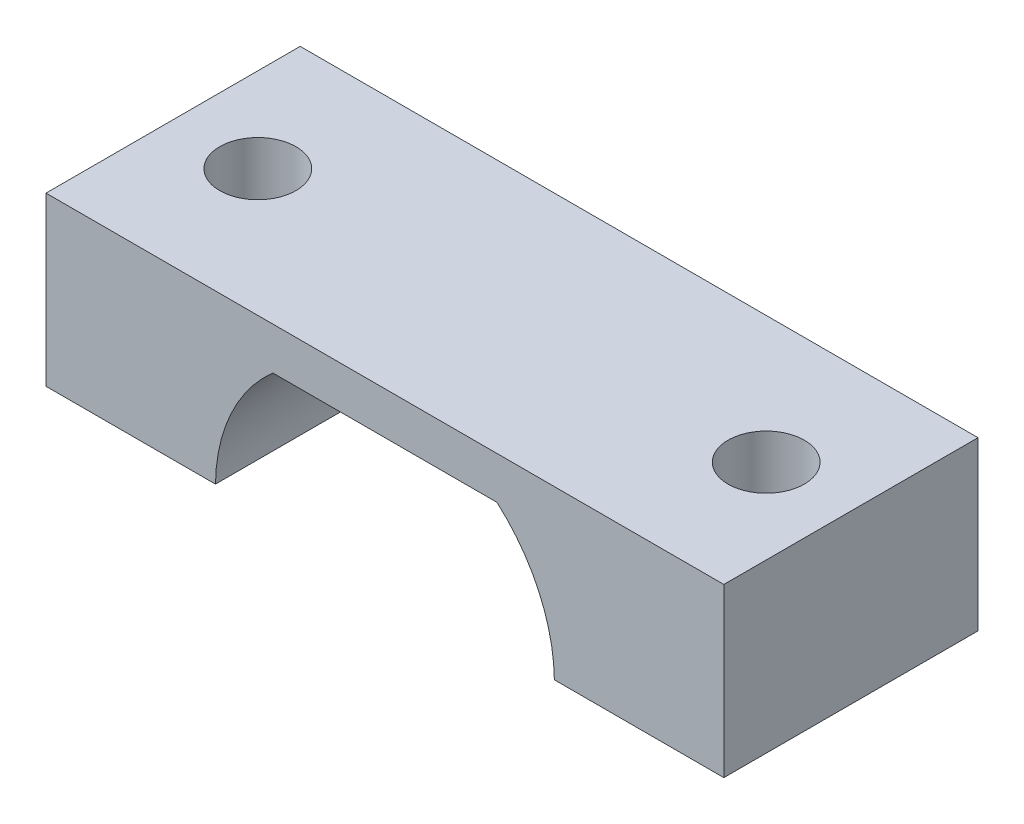
ISO-10303-21;
HEADER;
FILE_DESCRIPTION(('STEP AP214'),'2;1');
FILE_NAME('part.step','',(''),(''),'','','');
FILE_SCHEMA(('AUTOMOTIVE_DESIGN { 1 0 10303 214 1 1 1 1 }'));
ENDSEC;
DATA;
#1=APPLICATION_CONTEXT('core data for automotive mechanical design processes');
#2=APPLICATION_PROTOCOL_DEFINITION('international standard','automotive_design',2000,#1);
#3=PRODUCT_CONTEXT('',#1,'mechanical');
#4=PRODUCT('Part','Part','',(#3));
#5=PRODUCT_RELATED_PRODUCT_CATEGORY('part','',(#4));
#6=PRODUCT_DEFINITION_FORMATION('','',#4);
#7=PRODUCT_DEFINITION_CONTEXT('part definition',#1,'design');
#8=PRODUCT_DEFINITION('design','',#6,#7);
#9=PRODUCT_DEFINITION_SHAPE('','',#8);
#10=(LENGTH_UNIT() NAMED_UNIT(*) SI_UNIT(.MILLI.,.METRE.));
#11=(NAMED_UNIT(*) PLANE_ANGLE_UNIT() SI_UNIT($,.RADIAN.));
#12=(NAMED_UNIT(*) SI_UNIT($,.STERADIAN.) SOLID_ANGLE_UNIT());
#13=UNCERTAINTY_MEASURE_WITH_UNIT(LENGTH_MEASURE(1.E-05),#10,'distance_accuracy_value','');
#14=(GEOMETRIC_REPRESENTATION_CONTEXT(3) GLOBAL_UNCERTAINTY_ASSIGNED_CONTEXT((#13)) GLOBAL_UNIT_ASSIGNED_CONTEXT((#10,
#11,#12)) REPRESENTATION_CONTEXT('',''));
#15=CARTESIAN_POINT('',(0.,0.,0.));
#16=DIRECTION('',(0.,0.,1.));
#17=DIRECTION('',(1.,0.,0.));
#18=AXIS2_PLACEMENT_3D('',#15,#16,#17);
#19=CARTESIAN_POINT('',(0.,0.,7.5));
#20=DIRECTION('',(0.,0.,-1.));
#21=DIRECTION('',(-1.,0.,0.));
#22=AXIS2_PLACEMENT_3D('',#19,#20,#21);
#23=CYLINDRICAL_SURFACE('',#22,10.);
#24=CARTESIAN_POINT('',(0.,0.,-7.5));
#25=DIRECTION('',(0.,0.,-1.));
#26=DIRECTION('',(1.,0.,0.));
#27=AXIS2_PLACEMENT_3D('',#24,#25,#26);
#28=CIRCLE('',#27,10.);
#29=CARTESIAN_POINT('',(-9.99921871948004,0.125,-7.5));
#30=VERTEX_POINT('',#29);
#31=CARTESIAN_POINT('',(-6.61437827766148,7.5,-7.5));
#32=VERTEX_POINT('',#31);
#33=EDGE_CURVE('E140',#30,#32,#28,.T.);
#34=ORIENTED_EDGE('',*,*,#33,.T.);
#35=DIRECTION('',(0.,0.,-1.));
#36=VECTOR('',#35,1.);
#37=CARTESIAN_POINT('',(-6.61437827766148,7.5,7.5));
#38=LINE('',#37,#36);
#39=CARTESIAN_POINT('',(-6.61437827766148,7.5,7.5));
#40=VERTEX_POINT('',#39);
#41=EDGE_CURVE('E11',#40,#32,#38,.T.);
#42=ORIENTED_EDGE('',*,*,#41,.F.);
#43=CARTESIAN_POINT('',(0.,0.,7.5));
#44=DIRECTION('',(0.,0.,-1.));
#45=DIRECTION('',(1.,0.,0.));
#46=AXIS2_PLACEMENT_3D('',#43,#44,#45);
#47=CIRCLE('',#46,10.);
#48=CARTESIAN_POINT('',(-9.99921871948004,0.125,7.5));
#49=VERTEX_POINT('',#48);
#50=EDGE_CURVE('E163',#49,#40,#47,.T.);
#51=ORIENTED_EDGE('',*,*,#50,.F.);
#52=DIRECTION('',(0.,0.,-1.));
#53=VECTOR('',#52,1.);
#54=CARTESIAN_POINT('',(-9.99921871948004,0.125,7.5));
#55=LINE('',#54,#53);
#56=EDGE_CURVE('E136',#49,#30,#55,.T.);
#57=ORIENTED_EDGE('',*,*,#56,.T.);
#58=EDGE_LOOP('',(#34,#42,#51,#57));
#59=FACE_BOUND('',#58,.T.);
#60=ADVANCED_FACE('F39',(#59),#23,.F.);
#61=CARTESIAN_POINT('',(-6.61437827766148,7.5,7.5));
#62=DIRECTION('',(0.,1.,0.));
#63=DIRECTION('',(0.,0.,1.));
#64=AXIS2_PLACEMENT_3D('',#61,#62,#63);
#65=PLANE('',#64);
#66=DIRECTION('',(1.,0.,0.));
#67=VECTOR('',#66,1.);
#68=CARTESIAN_POINT('',(-6.61437827766148,7.5,-7.5));
#69=LINE('',#68,#67);
#70=CARTESIAN_POINT('',(6.61437827766148,7.5,-7.5));
#71=VERTEX_POINT('',#70);
#72=EDGE_CURVE('E144',#32,#71,#69,.T.);
#73=ORIENTED_EDGE('',*,*,#72,.T.);
#74=DIRECTION('',(0.,0.,-1.));
#75=VECTOR('',#74,1.);
#76=CARTESIAN_POINT('',(6.61437827766148,7.5,7.5));
#77=LINE('',#76,#75);
#78=CARTESIAN_POINT('',(6.61437827766148,7.5,7.5));
#79=VERTEX_POINT('',#78);
#80=EDGE_CURVE('E48',#79,#71,#77,.T.);
#81=ORIENTED_EDGE('',*,*,#80,.F.);
#82=DIRECTION('',(1.,0.,0.));
#83=VECTOR('',#82,1.);
#84=CARTESIAN_POINT('',(-6.61437827766148,7.5,7.5));
#85=LINE('',#84,#83);
#86=EDGE_CURVE('E99',#40,#79,#85,.T.);
#87=ORIENTED_EDGE('',*,*,#86,.F.);
#88=ORIENTED_EDGE('',*,*,#41,.T.);
#89=EDGE_LOOP('',(#73,#81,#87,#88));
#90=FACE_BOUND('',#89,.T.);
#91=ADVANCED_FACE('F245',(#90),#65,.F.);
#92=CARTESIAN_POINT('',(0.,0.,7.5));
#93=DIRECTION('',(0.,0.,-1.));
#94=DIRECTION('',(-1.,0.,0.));
#95=AXIS2_PLACEMENT_3D('',#92,#93,#94);
#96=CYLINDRICAL_SURFACE('',#95,10.);
#97=CARTESIAN_POINT('',(0.,0.,-7.5));
#98=DIRECTION('',(0.,0.,-1.));
#99=DIRECTION('',(1.,0.,0.));
#100=AXIS2_PLACEMENT_3D('',#97,#98,#99);
#101=CIRCLE('',#100,10.);
#102=CARTESIAN_POINT('',(9.99921871948004,0.125,-7.5));
#103=VERTEX_POINT('',#102);
#104=EDGE_CURVE('E148',#71,#103,#101,.T.);
#105=ORIENTED_EDGE('',*,*,#104,.T.);
#106=DIRECTION('',(0.,0.,-1.));
#107=VECTOR('',#106,1.);
#108=CARTESIAN_POINT('',(9.99921871948004,0.125,7.5));
#109=LINE('',#108,#107);
#110=CARTESIAN_POINT('',(9.99921871948004,0.125,7.5));
#111=VERTEX_POINT('',#110);
#112=EDGE_CURVE('E174',#111,#103,#109,.T.);
#113=ORIENTED_EDGE('',*,*,#112,.F.);
#114=CARTESIAN_POINT('',(0.,0.,7.5));
#115=DIRECTION('',(0.,0.,-1.));
#116=DIRECTION('',(1.,0.,0.));
#117=AXIS2_PLACEMENT_3D('',#114,#115,#116);
#118=CIRCLE('',#117,10.);
#119=EDGE_CURVE('E184',#79,#111,#118,.T.);
#120=ORIENTED_EDGE('',*,*,#119,.F.);
#121=ORIENTED_EDGE('',*,*,#80,.T.);
#122=EDGE_LOOP('',(#105,#113,#120,#121));
#123=FACE_BOUND('',#122,.T.);
#124=ADVANCED_FACE('F182',(#123),#96,.F.);
#125=CARTESIAN_POINT('',(9.99921871948004,0.125,7.5));
#126=DIRECTION('',(0.,1.,0.));
#127=DIRECTION('',(0.,0.,1.));
#128=AXIS2_PLACEMENT_3D('',#125,#126,#127);
#129=PLANE('',#128);
#130=CARTESIAN_POINT('',(15.,0.125,0.));
#131=DIRECTION('',(0.,1.,0.));
#132=DIRECTION('',(0.,0.,1.));
#133=AXIS2_PLACEMENT_3D('',#130,#131,#132);
#134=CIRCLE('',#133,2.25);
#135=CARTESIAN_POINT('',(15.,0.125,2.24999999999999));
#136=VERTEX_POINT('',#135);
#137=EDGE_CURVE('E211',#136,#136,#134,.T.);
#138=ORIENTED_EDGE('',*,*,#137,.T.);
#139=EDGE_LOOP('',(#138));
#140=FACE_BOUND('',#139,.T.);
#141=DIRECTION('',(1.,0.,0.));
#142=VECTOR('',#141,1.);
#143=CARTESIAN_POINT('',(9.99921871948004,0.125,-7.5));
#144=LINE('',#143,#142);
#145=CARTESIAN_POINT('',(20.,0.125,-7.5));
#146=VERTEX_POINT('',#145);
#147=EDGE_CURVE('E151',#103,#146,#144,.T.);
#148=ORIENTED_EDGE('',*,*,#147,.T.);
#149=DIRECTION('',(0.,0.,-1.));
#150=VECTOR('',#149,1.);
#151=CARTESIAN_POINT('',(20.,0.125,7.5));
#152=LINE('',#151,#150);
#153=CARTESIAN_POINT('',(20.,0.125,7.5));
#154=VERTEX_POINT('',#153);
#155=EDGE_CURVE('E170',#154,#146,#152,.T.);
#156=ORIENTED_EDGE('',*,*,#155,.F.);
#157=DIRECTION('',(1.,0.,0.));
#158=VECTOR('',#157,1.);
#159=CARTESIAN_POINT('',(9.99921871948004,0.125,7.5));
#160=LINE('',#159,#158);
#161=EDGE_CURVE('E197',#111,#154,#160,.T.);
#162=ORIENTED_EDGE('',*,*,#161,.F.);
#163=ORIENTED_EDGE('',*,*,#112,.T.);
#164=EDGE_LOOP('',(#148,#156,#162,#163));
#165=FACE_BOUND('',#164,.T.);
#166=ADVANCED_FACE('F192',(#140,#165),#129,.F.);
#167=CARTESIAN_POINT('',(20.,10.,7.5));
#168=DIRECTION('',(-1.,0.,0.));
#169=DIRECTION('',(0.,-1.,0.));
#170=AXIS2_PLACEMENT_3D('',#167,#168,#169);
#171=PLANE('',#170);
#172=DIRECTION('',(0.,1.,0.));
#173=VECTOR('',#172,1.);
#174=CARTESIAN_POINT('',(20.,10.,-7.5));
#175=LINE('',#174,#173);
#176=CARTESIAN_POINT('',(20.,10.,-7.5));
#177=VERTEX_POINT('',#176);
#178=EDGE_CURVE('E154',#146,#177,#175,.T.);
#179=ORIENTED_EDGE('',*,*,#178,.T.);
#180=DIRECTION('',(0.,0.,-1.));
#181=VECTOR('',#180,1.);
#182=CARTESIAN_POINT('',(20.,10.,7.5));
#183=LINE('',#182,#181);
#184=CARTESIAN_POINT('',(20.,10.,7.5));
#185=VERTEX_POINT('',#184);
#186=EDGE_CURVE('E129',#185,#177,#183,.T.);
#187=ORIENTED_EDGE('',*,*,#186,.F.);
#188=DIRECTION('',(0.,1.,0.));
#189=VECTOR('',#188,1.);
#190=CARTESIAN_POINT('',(20.,10.,7.5));
#191=LINE('',#190,#189);
#192=EDGE_CURVE('E118',#154,#185,#191,.T.);
#193=ORIENTED_EDGE('',*,*,#192,.F.);
#194=ORIENTED_EDGE('',*,*,#155,.T.);
#195=EDGE_LOOP('',(#179,#187,#193,#194));
#196=FACE_BOUND('',#195,.T.);
#197=ADVANCED_FACE('F195',(#196),#171,.F.);
#198=CARTESIAN_POINT('',(-20.,10.,7.5));
#199=DIRECTION('',(0.,-1.,0.));
#200=DIRECTION('',(0.,0.,-1.));
#201=AXIS2_PLACEMENT_3D('',#198,#199,#200);
#202=PLANE('',#201);
#203=CARTESIAN_POINT('',(-15.,10.,0.));
#204=DIRECTION('',(0.,1.,0.));
#205=DIRECTION('',(0.,0.,1.));
#206=AXIS2_PLACEMENT_3D('',#203,#204,#205);
#207=CIRCLE('',#206,2.25);
#208=CARTESIAN_POINT('',(-15.,10.,2.25));
#209=VERTEX_POINT('',#208);
#210=EDGE_CURVE('E215',#209,#209,#207,.T.);
#211=ORIENTED_EDGE('',*,*,#210,.F.);
#212=EDGE_LOOP('',(#211));
#213=FACE_BOUND('',#212,.T.);
#214=CARTESIAN_POINT('',(15.,10.,0.));
#215=DIRECTION('',(0.,1.,0.));
#216=DIRECTION('',(0.,0.,1.));
#217=AXIS2_PLACEMENT_3D('',#214,#215,#216);
#218=CIRCLE('',#217,2.25);
#219=CARTESIAN_POINT('',(15.,10.,2.24999999999999));
#220=VERTEX_POINT('',#219);
#221=EDGE_CURVE('E207',#220,#220,#218,.T.);
#222=ORIENTED_EDGE('',*,*,#221,.F.);
#223=EDGE_LOOP('',(#222));
#224=FACE_BOUND('',#223,.T.);
#225=DIRECTION('',(-1.,0.,0.));
#226=VECTOR('',#225,1.);
#227=CARTESIAN_POINT('',(-20.,10.,-7.5));
#228=LINE('',#227,#226);
#229=CARTESIAN_POINT('',(-20.,10.,-7.5));
#230=VERTEX_POINT('',#229);
#231=EDGE_CURVE('E127',#177,#230,#228,.T.);
#232=ORIENTED_EDGE('',*,*,#231,.T.);
#233=DIRECTION('',(0.,0.,-1.));
#234=VECTOR('',#233,1.);
#235=CARTESIAN_POINT('',(-20.,10.,7.5));
#236=LINE('',#235,#234);
#237=CARTESIAN_POINT('',(-20.,10.,7.5));
#238=VERTEX_POINT('',#237);
#239=EDGE_CURVE('E124',#238,#230,#236,.T.);
#240=ORIENTED_EDGE('',*,*,#239,.F.);
#241=DIRECTION('',(-1.,0.,0.));
#242=VECTOR('',#241,1.);
#243=CARTESIAN_POINT('',(-20.,10.,7.5));
#244=LINE('',#243,#242);
#245=EDGE_CURVE('E112',#185,#238,#244,.T.);
#246=ORIENTED_EDGE('',*,*,#245,.F.);
#247=ORIENTED_EDGE('',*,*,#186,.T.);
#248=EDGE_LOOP('',(#232,#240,#246,#247));
#249=FACE_BOUND('',#248,.T.);
#250=ADVANCED_FACE('F125',(#213,#224,#249),#202,.F.);
#251=CARTESIAN_POINT('',(-20.,0.125,7.5));
#252=DIRECTION('',(1.,0.,0.));
#253=DIRECTION('',(0.,1.,0.));
#254=AXIS2_PLACEMENT_3D('',#251,#252,#253);
#255=PLANE('',#254);
#256=DIRECTION('',(0.,-1.,0.));
#257=VECTOR('',#256,1.);
#258=CARTESIAN_POINT('',(-20.,0.125,-7.5));
#259=LINE('',#258,#257);
#260=CARTESIAN_POINT('',(-20.,0.125,-7.5));
#261=VERTEX_POINT('',#260);
#262=EDGE_CURVE('E85',#230,#261,#259,.T.);
#263=ORIENTED_EDGE('',*,*,#262,.T.);
#264=DIRECTION('',(0.,0.,-1.));
#265=VECTOR('',#264,1.);
#266=CARTESIAN_POINT('',(-20.,0.125,7.5));
#267=LINE('',#266,#265);
#268=CARTESIAN_POINT('',(-20.,0.125,7.5));
#269=VERTEX_POINT('',#268);
#270=EDGE_CURVE('E130',#269,#261,#267,.T.);
#271=ORIENTED_EDGE('',*,*,#270,.F.);
#272=DIRECTION('',(0.,-1.,0.));
#273=VECTOR('',#272,1.);
#274=CARTESIAN_POINT('',(-20.,0.125,7.5));
#275=LINE('',#274,#273);
#276=EDGE_CURVE('E116',#238,#269,#275,.T.);
#277=ORIENTED_EDGE('',*,*,#276,.F.);
#278=ORIENTED_EDGE('',*,*,#239,.T.);
#279=EDGE_LOOP('',(#263,#271,#277,#278));
#280=FACE_BOUND('',#279,.T.);
#281=ADVANCED_FACE('F132',(#280),#255,.F.);
#282=CARTESIAN_POINT('',(-20.,0.125,7.5));
#283=DIRECTION('',(0.,1.,0.));
#284=DIRECTION('',(0.,0.,1.));
#285=AXIS2_PLACEMENT_3D('',#282,#283,#284);
#286=PLANE('',#285);
#287=CARTESIAN_POINT('',(-15.,0.125,0.));
#288=DIRECTION('',(0.,1.,0.));
#289=DIRECTION('',(0.,0.,1.));
#290=AXIS2_PLACEMENT_3D('',#287,#288,#289);
#291=CIRCLE('',#290,2.25);
#292=CARTESIAN_POINT('',(-15.,0.125,2.25));
#293=VERTEX_POINT('',#292);
#294=EDGE_CURVE('E145',#293,#293,#291,.T.);
#295=ORIENTED_EDGE('',*,*,#294,.T.);
#296=EDGE_LOOP('',(#295));
#297=FACE_BOUND('',#296,.T.);
#298=DIRECTION('',(1.,0.,0.));
#299=VECTOR('',#298,1.);
#300=CARTESIAN_POINT('',(-20.,0.125,-7.5));
#301=LINE('',#300,#299);
#302=EDGE_CURVE('E91',#261,#30,#301,.T.);
#303=ORIENTED_EDGE('',*,*,#302,.T.);
#304=ORIENTED_EDGE('',*,*,#56,.F.);
#305=DIRECTION('',(1.,0.,0.));
#306=VECTOR('',#305,1.);
#307=CARTESIAN_POINT('',(-20.,0.125,7.5));
#308=LINE('',#307,#306);
#309=EDGE_CURVE('E56',#269,#49,#308,.T.);
#310=ORIENTED_EDGE('',*,*,#309,.F.);
#311=ORIENTED_EDGE('',*,*,#270,.T.);
#312=EDGE_LOOP('',(#303,#304,#310,#311));
#313=FACE_BOUND('',#312,.T.);
#314=ADVANCED_FACE('F223',(#297,#313),#286,.F.);
#315=CARTESIAN_POINT('',(0.,0.,7.5));
#316=DIRECTION('',(0.,0.,1.));
#317=DIRECTION('',(1.,0.,0.));
#318=AXIS2_PLACEMENT_3D('',#315,#316,#317);
#319=PLANE('',#318);
#320=ORIENTED_EDGE('',*,*,#50,.T.);
#321=ORIENTED_EDGE('',*,*,#86,.T.);
#322=ORIENTED_EDGE('',*,*,#119,.T.);
#323=ORIENTED_EDGE('',*,*,#161,.T.);
#324=ORIENTED_EDGE('',*,*,#192,.T.);
#325=ORIENTED_EDGE('',*,*,#245,.T.);
#326=ORIENTED_EDGE('',*,*,#276,.T.);
#327=ORIENTED_EDGE('',*,*,#309,.T.);
#328=EDGE_LOOP('',(#320,#321,#322,#323,#324,#325,#326,#327));
#329=FACE_BOUND('',#328,.T.);
#330=ADVANCED_FACE('F114',(#329),#319,.T.);
#331=CARTESIAN_POINT('',(0.,0.,-7.5));
#332=DIRECTION('',(0.,0.,1.));
#333=DIRECTION('',(1.,0.,0.));
#334=AXIS2_PLACEMENT_3D('',#331,#332,#333);
#335=PLANE('',#334);
#336=ORIENTED_EDGE('',*,*,#33,.F.);
#337=ORIENTED_EDGE('',*,*,#302,.F.);
#338=ORIENTED_EDGE('',*,*,#262,.F.);
#339=ORIENTED_EDGE('',*,*,#231,.F.);
#340=ORIENTED_EDGE('',*,*,#178,.F.);
#341=ORIENTED_EDGE('',*,*,#147,.F.);
#342=ORIENTED_EDGE('',*,*,#104,.F.);
#343=ORIENTED_EDGE('',*,*,#72,.F.);
#344=EDGE_LOOP('',(#336,#337,#338,#339,#340,#341,#342,#343));
#345=FACE_BOUND('',#344,.T.);
#346=ADVANCED_FACE('F188',(#345),#335,.F.);
#347=CARTESIAN_POINT('',(-15.,0.125,0.));
#348=DIRECTION('',(0.,1.,0.));
#349=DIRECTION('',(0.,0.,1.));
#350=AXIS2_PLACEMENT_3D('',#347,#348,#349);
#351=CYLINDRICAL_SURFACE('',#350,2.25);
#352=ORIENTED_EDGE('',*,*,#294,.F.);
#353=EDGE_LOOP('',(#352));
#354=FACE_BOUND('',#353,.T.);
#355=ORIENTED_EDGE('',*,*,#210,.T.);
#356=EDGE_LOOP('',(#355));
#357=FACE_BOUND('',#356,.T.);
#358=ADVANCED_FACE('F225',(#354,#357),#351,.F.);
#359=CARTESIAN_POINT('',(15.,0.125,0.));
#360=DIRECTION('',(0.,1.,0.));
#361=DIRECTION('',(0.,0.,1.));
#362=AXIS2_PLACEMENT_3D('',#359,#360,#361);
#363=CYLINDRICAL_SURFACE('',#362,2.25);
#364=ORIENTED_EDGE('',*,*,#137,.F.);
#365=EDGE_LOOP('',(#364));
#366=FACE_BOUND('',#365,.T.);
#367=ORIENTED_EDGE('',*,*,#221,.T.);
#368=EDGE_LOOP('',(#367));
#369=FACE_BOUND('',#368,.T.);
#370=ADVANCED_FACE('F228',(#366,#369),#363,.F.);
#371=CLOSED_SHELL('',(#60,#91,#124,#166,#197,#250,#281,#314,#330,#346,#358,#370));
#372=MANIFOLD_SOLID_BREP('B2',#371);
#373=ADVANCED_BREP_SHAPE_REPRESENTATION('',(#18,#372),#14);
#374=SHAPE_DEFINITION_REPRESENTATION(#9,#373);
ENDSEC;
END-ISO-10303-21;
